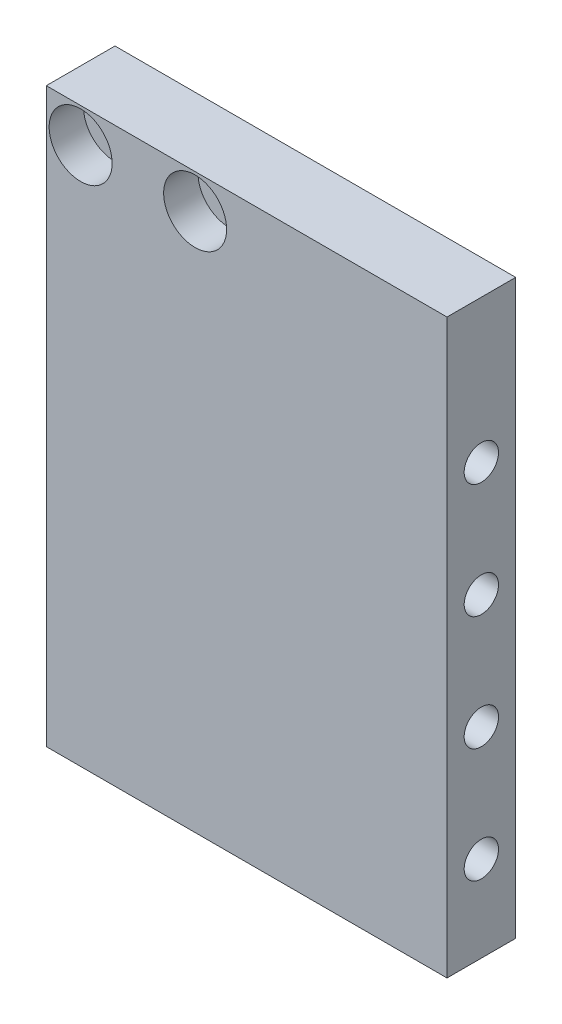
ISO-10303-21;
HEADER;
FILE_DESCRIPTION(('STEP AP214'),'2;1');
FILE_NAME('part.step','',(''),(''),'','','');
FILE_SCHEMA(('AUTOMOTIVE_DESIGN { 1 0 10303 214 1 1 1 1 }'));
ENDSEC;
DATA;
#1=APPLICATION_CONTEXT('core data for automotive mechanical design processes');
#2=APPLICATION_PROTOCOL_DEFINITION('international standard','automotive_design',2000,#1);
#3=PRODUCT_CONTEXT('',#1,'mechanical');
#4=PRODUCT('Part','Part','',(#3));
#5=PRODUCT_RELATED_PRODUCT_CATEGORY('part','',(#4));
#6=PRODUCT_DEFINITION_FORMATION('','',#4);
#7=PRODUCT_DEFINITION_CONTEXT('part definition',#1,'design');
#8=PRODUCT_DEFINITION('design','',#6,#7);
#9=PRODUCT_DEFINITION_SHAPE('','',#8);
#10=(LENGTH_UNIT() NAMED_UNIT(*) SI_UNIT(.MILLI.,.METRE.));
#11=(NAMED_UNIT(*) PLANE_ANGLE_UNIT() SI_UNIT($,.RADIAN.));
#12=(NAMED_UNIT(*) SI_UNIT($,.STERADIAN.) SOLID_ANGLE_UNIT());
#13=UNCERTAINTY_MEASURE_WITH_UNIT(LENGTH_MEASURE(1.E-05),#10,'distance_accuracy_value','');
#14=(GEOMETRIC_REPRESENTATION_CONTEXT(3) GLOBAL_UNCERTAINTY_ASSIGNED_CONTEXT((#13)) GLOBAL_UNIT_ASSIGNED_CONTEXT((#10,
#11,#12)) REPRESENTATION_CONTEXT('',''));
#15=CARTESIAN_POINT('',(0.,0.,0.));
#16=DIRECTION('',(0.,0.,1.));
#17=DIRECTION('',(1.,0.,0.));
#18=AXIS2_PLACEMENT_3D('',#15,#16,#17);
#19=CARTESIAN_POINT('',(-9.,44.,0.));
#20=DIRECTION('',(0.,0.,1.));
#21=DIRECTION('',(1.,0.,0.));
#22=AXIS2_PLACEMENT_3D('',#19,#20,#21);
#23=CYLINDRICAL_SURFACE('',#22,3.);
#24=CARTESIAN_POINT('',(-9.,44.,0.));
#25=DIRECTION('',(0.,0.,1.));
#26=DIRECTION('',(1.,0.,0.));
#27=AXIS2_PLACEMENT_3D('',#24,#25,#26);
#28=CIRCLE('',#27,3.);
#29=CARTESIAN_POINT('',(-6.,44.,0.));
#30=VERTEX_POINT('',#29);
#31=EDGE_CURVE('E114',#30,#30,#28,.T.);
#32=ORIENTED_EDGE('',*,*,#31,.F.);
#33=EDGE_LOOP('',(#32));
#34=FACE_BOUND('',#33,.T.);
#35=CARTESIAN_POINT('',(-9.,44.,6.));
#36=DIRECTION('',(0.,0.,1.));
#37=DIRECTION('',(1.,0.,0.));
#38=AXIS2_PLACEMENT_3D('',#35,#36,#37);
#39=CIRCLE('',#38,3.);
#40=CARTESIAN_POINT('',(-6.,44.,6.));
#41=VERTEX_POINT('',#40);
#42=EDGE_CURVE('E37',#41,#41,#39,.F.);
#43=ORIENTED_EDGE('',*,*,#42,.F.);
#44=EDGE_LOOP('',(#43));
#45=FACE_BOUND('',#44,.T.);
#46=ADVANCED_FACE('F33',(#34,#45),#23,.F.);
#47=CARTESIAN_POINT('',(-29.,44.,0.));
#48=DIRECTION('',(0.,0.,1.));
#49=DIRECTION('',(1.,0.,0.));
#50=AXIS2_PLACEMENT_3D('',#47,#48,#49);
#51=CYLINDRICAL_SURFACE('',#50,3.);
#52=CARTESIAN_POINT('',(-29.,44.,0.));
#53=DIRECTION('',(0.,0.,1.));
#54=DIRECTION('',(1.,0.,0.));
#55=AXIS2_PLACEMENT_3D('',#52,#53,#54);
#56=CIRCLE('',#55,3.);
#57=CARTESIAN_POINT('',(-26.,44.,0.));
#58=VERTEX_POINT('',#57);
#59=EDGE_CURVE('E133',#58,#58,#56,.T.);
#60=ORIENTED_EDGE('',*,*,#59,.F.);
#61=EDGE_LOOP('',(#60));
#62=FACE_BOUND('',#61,.T.);
#63=CARTESIAN_POINT('',(-29.,44.,6.));
#64=DIRECTION('',(0.,0.,1.));
#65=DIRECTION('',(1.,0.,0.));
#66=AXIS2_PLACEMENT_3D('',#63,#64,#65);
#67=CIRCLE('',#66,3.);
#68=CARTESIAN_POINT('',(-26.,44.,6.));
#69=VERTEX_POINT('',#68);
#70=EDGE_CURVE('E108',#69,#69,#67,.F.);
#71=ORIENTED_EDGE('',*,*,#70,.F.);
#72=EDGE_LOOP('',(#71));
#73=FACE_BOUND('',#72,.T.);
#74=ADVANCED_FACE('F166',(#62,#73),#51,.F.);
#75=CARTESIAN_POINT('',(-35.,-50.,12.));
#76=DIRECTION('',(1.,0.,0.));
#77=DIRECTION('',(0.,0.,-1.));
#78=AXIS2_PLACEMENT_3D('',#75,#76,#77);
#79=PLANE('',#78);
#80=CARTESIAN_POINT('',(-35.,-35.,6.));
#81=DIRECTION('',(-1.,0.,0.));
#82=DIRECTION('',(0.,0.,1.));
#83=AXIS2_PLACEMENT_3D('',#80,#81,#82);
#84=CIRCLE('',#83,3.);
#85=CARTESIAN_POINT('',(-35.,-35.,9.));
#86=VERTEX_POINT('',#85);
#87=EDGE_CURVE('E141',#86,#86,#84,.T.);
#88=ORIENTED_EDGE('',*,*,#87,.F.);
#89=EDGE_LOOP('',(#88));
#90=FACE_BOUND('',#89,.T.);
#91=CARTESIAN_POINT('',(-35.,-15.,6.));
#92=DIRECTION('',(-1.,0.,0.));
#93=DIRECTION('',(0.,0.,1.));
#94=AXIS2_PLACEMENT_3D('',#91,#92,#93);
#95=CIRCLE('',#94,3.);
#96=CARTESIAN_POINT('',(-35.,-15.,9.));
#97=VERTEX_POINT('',#96);
#98=EDGE_CURVE('E147',#97,#97,#95,.T.);
#99=ORIENTED_EDGE('',*,*,#98,.F.);
#100=EDGE_LOOP('',(#99));
#101=FACE_BOUND('',#100,.T.);
#102=CARTESIAN_POINT('',(-35.,5.,6.));
#103=DIRECTION('',(-1.,0.,0.));
#104=DIRECTION('',(0.,0.,1.));
#105=AXIS2_PLACEMENT_3D('',#102,#103,#104);
#106=CIRCLE('',#105,3.);
#107=CARTESIAN_POINT('',(-35.,5.,9.));
#108=VERTEX_POINT('',#107);
#109=EDGE_CURVE('E153',#108,#108,#106,.T.);
#110=ORIENTED_EDGE('',*,*,#109,.F.);
#111=EDGE_LOOP('',(#110));
#112=FACE_BOUND('',#111,.T.);
#113=CARTESIAN_POINT('',(-35.,25.,6.));
#114=DIRECTION('',(-1.,0.,0.));
#115=DIRECTION('',(0.,0.,1.));
#116=AXIS2_PLACEMENT_3D('',#113,#114,#115);
#117=CIRCLE('',#116,3.);
#118=CARTESIAN_POINT('',(-35.,25.,9.));
#119=VERTEX_POINT('',#118);
#120=EDGE_CURVE('E136',#119,#119,#117,.T.);
#121=ORIENTED_EDGE('',*,*,#120,.F.);
#122=EDGE_LOOP('',(#121));
#123=FACE_BOUND('',#122,.T.);
#124=DIRECTION('',(0.,-1.,0.));
#125=VECTOR('',#124,1.);
#126=CARTESIAN_POINT('',(-35.,-50.,0.));
#127=LINE('',#126,#125);
#128=CARTESIAN_POINT('',(-35.,50.,0.));
#129=VERTEX_POINT('',#128);
#130=CARTESIAN_POINT('',(-35.,-50.,0.));
#131=VERTEX_POINT('',#130);
#132=EDGE_CURVE('E100',#129,#131,#127,.T.);
#133=ORIENTED_EDGE('',*,*,#132,.T.);
#134=DIRECTION('',(0.,0.,-1.));
#135=VECTOR('',#134,1.);
#136=CARTESIAN_POINT('',(-35.,-50.,12.));
#137=LINE('',#136,#135);
#138=CARTESIAN_POINT('',(-35.,-50.,12.));
#139=VERTEX_POINT('',#138);
#140=EDGE_CURVE('E11',#139,#131,#137,.T.);
#141=ORIENTED_EDGE('',*,*,#140,.F.);
#142=DIRECTION('',(0.,-1.,0.));
#143=VECTOR('',#142,1.);
#144=CARTESIAN_POINT('',(-35.,-50.,12.));
#145=LINE('',#144,#143);
#146=CARTESIAN_POINT('',(-35.,50.,12.));
#147=VERTEX_POINT('',#146);
#148=EDGE_CURVE('E87',#147,#139,#145,.T.);
#149=ORIENTED_EDGE('',*,*,#148,.F.);
#150=DIRECTION('',(0.,0.,-1.));
#151=VECTOR('',#150,1.);
#152=CARTESIAN_POINT('',(-35.,50.,12.));
#153=LINE('',#152,#151);
#154=EDGE_CURVE('E96',#147,#129,#153,.T.);
#155=ORIENTED_EDGE('',*,*,#154,.T.);
#156=EDGE_LOOP('',(#133,#141,#149,#155));
#157=FACE_BOUND('',#156,.T.);
#158=ADVANCED_FACE('F35',(#90,#101,#112,#123,#157),#79,.F.);
#159=CARTESIAN_POINT('',(35.,-50.,12.));
#160=DIRECTION('',(0.,1.,0.));
#161=DIRECTION('',(-1.,0.,0.));
#162=AXIS2_PLACEMENT_3D('',#159,#160,#161);
#163=PLANE('',#162);
#164=CARTESIAN_POINT('',(-21.,-50.,6.));
#165=DIRECTION('',(0.,-1.,0.));
#166=DIRECTION('',(1.,0.,0.));
#167=AXIS2_PLACEMENT_3D('',#164,#165,#166);
#168=CIRCLE('',#167,3.);
#169=CARTESIAN_POINT('',(-18.,-50.,6.));
#170=VERTEX_POINT('',#169);
#171=EDGE_CURVE('E524',#170,#170,#168,.T.);
#172=ORIENTED_EDGE('',*,*,#171,.F.);
#173=EDGE_LOOP('',(#172));
#174=FACE_BOUND('',#173,.T.);
#175=CARTESIAN_POINT('',(-7.,-50.,6.));
#176=DIRECTION('',(0.,-1.,0.));
#177=DIRECTION('',(1.,0.,0.));
#178=AXIS2_PLACEMENT_3D('',#175,#176,#177);
#179=CIRCLE('',#178,3.);
#180=CARTESIAN_POINT('',(-4.,-50.,6.));
#181=VERTEX_POINT('',#180);
#182=EDGE_CURVE('E528',#181,#181,#179,.T.);
#183=ORIENTED_EDGE('',*,*,#182,.F.);
#184=EDGE_LOOP('',(#183));
#185=FACE_BOUND('',#184,.T.);
#186=CARTESIAN_POINT('',(7.,-50.,6.));
#187=DIRECTION('',(0.,-1.,0.));
#188=DIRECTION('',(1.,0.,0.));
#189=AXIS2_PLACEMENT_3D('',#186,#187,#188);
#190=CIRCLE('',#189,3.);
#191=CARTESIAN_POINT('',(10.,-50.,6.));
#192=VERTEX_POINT('',#191);
#193=EDGE_CURVE('E532',#192,#192,#190,.T.);
#194=ORIENTED_EDGE('',*,*,#193,.F.);
#195=EDGE_LOOP('',(#194));
#196=FACE_BOUND('',#195,.T.);
#197=CARTESIAN_POINT('',(21.,-50.,6.));
#198=DIRECTION('',(0.,-1.,0.));
#199=DIRECTION('',(1.,0.,0.));
#200=AXIS2_PLACEMENT_3D('',#197,#198,#199);
#201=CIRCLE('',#200,3.);
#202=CARTESIAN_POINT('',(24.,-50.,6.));
#203=VERTEX_POINT('',#202);
#204=EDGE_CURVE('E535',#203,#203,#201,.T.);
#205=ORIENTED_EDGE('',*,*,#204,.F.);
#206=EDGE_LOOP('',(#205));
#207=FACE_BOUND('',#206,.T.);
#208=DIRECTION('',(1.,0.,0.));
#209=VECTOR('',#208,1.);
#210=CARTESIAN_POINT('',(35.,-50.,0.));
#211=LINE('',#210,#209);
#212=CARTESIAN_POINT('',(35.,-50.,0.));
#213=VERTEX_POINT('',#212);
#214=EDGE_CURVE('E91',#131,#213,#211,.T.);
#215=ORIENTED_EDGE('',*,*,#214,.T.);
#216=DIRECTION('',(0.,0.,-1.));
#217=VECTOR('',#216,1.);
#218=CARTESIAN_POINT('',(35.,-50.,12.));
#219=LINE('',#218,#217);
#220=CARTESIAN_POINT('',(35.,-50.,12.));
#221=VERTEX_POINT('',#220);
#222=EDGE_CURVE('E43',#221,#213,#219,.T.);
#223=ORIENTED_EDGE('',*,*,#222,.F.);
#224=DIRECTION('',(1.,0.,0.));
#225=VECTOR('',#224,1.);
#226=CARTESIAN_POINT('',(35.,-50.,12.));
#227=LINE('',#226,#225);
#228=EDGE_CURVE('E82',#139,#221,#227,.T.);
#229=ORIENTED_EDGE('',*,*,#228,.F.);
#230=ORIENTED_EDGE('',*,*,#140,.T.);
#231=EDGE_LOOP('',(#215,#223,#229,#230));
#232=FACE_BOUND('',#231,.T.);
#233=ADVANCED_FACE('F90',(#174,#185,#196,#207,#232),#163,.F.);
#234=CARTESIAN_POINT('',(35.,-50.,12.));
#235=DIRECTION('',(-1.,0.,0.));
#236=DIRECTION('',(0.,0.,1.));
#237=AXIS2_PLACEMENT_3D('',#234,#235,#236);
#238=PLANE('',#237);
#239=CARTESIAN_POINT('',(35.,-35.,6.));
#240=DIRECTION('',(1.,0.,0.));
#241=DIRECTION('',(0.,0.,-1.));
#242=AXIS2_PLACEMENT_3D('',#239,#240,#241);
#243=CIRCLE('',#242,3.);
#244=CARTESIAN_POINT('',(35.,-35.,3.));
#245=VERTEX_POINT('',#244);
#246=EDGE_CURVE('E545',#245,#245,#243,.T.);
#247=ORIENTED_EDGE('',*,*,#246,.F.);
#248=EDGE_LOOP('',(#247));
#249=FACE_BOUND('',#248,.T.);
#250=CARTESIAN_POINT('',(35.,-15.,6.00000000000007));
#251=DIRECTION('',(1.,0.,0.));
#252=DIRECTION('',(0.,0.,-1.));
#253=AXIS2_PLACEMENT_3D('',#250,#251,#252);
#254=CIRCLE('',#253,3.);
#255=CARTESIAN_POINT('',(35.,-15.,3.00000000000007));
#256=VERTEX_POINT('',#255);
#257=EDGE_CURVE('E551',#256,#256,#254,.T.);
#258=ORIENTED_EDGE('',*,*,#257,.F.);
#259=EDGE_LOOP('',(#258));
#260=FACE_BOUND('',#259,.T.);
#261=CARTESIAN_POINT('',(35.,5.00000000000001,6.00000000000014));
#262=DIRECTION('',(1.,0.,0.));
#263=DIRECTION('',(0.,0.,-1.));
#264=AXIS2_PLACEMENT_3D('',#261,#262,#263);
#265=CIRCLE('',#264,3.);
#266=CARTESIAN_POINT('',(35.,5.00000000000001,3.00000000000014));
#267=VERTEX_POINT('',#266);
#268=EDGE_CURVE('E557',#267,#267,#265,.T.);
#269=ORIENTED_EDGE('',*,*,#268,.F.);
#270=EDGE_LOOP('',(#269));
#271=FACE_BOUND('',#270,.T.);
#272=CARTESIAN_POINT('',(35.,25.,6.00000000000021));
#273=DIRECTION('',(1.,0.,0.));
#274=DIRECTION('',(0.,0.,-1.));
#275=AXIS2_PLACEMENT_3D('',#272,#273,#274);
#276=CIRCLE('',#275,3.);
#277=CARTESIAN_POINT('',(35.,25.,3.0000000000002));
#278=VERTEX_POINT('',#277);
#279=EDGE_CURVE('E124',#278,#278,#276,.T.);
#280=ORIENTED_EDGE('',*,*,#279,.F.);
#281=EDGE_LOOP('',(#280));
#282=FACE_BOUND('',#281,.T.);
#283=DIRECTION('',(0.,1.,0.));
#284=VECTOR('',#283,1.);
#285=CARTESIAN_POINT('',(35.,-50.,0.));
#286=LINE('',#285,#284);
#287=CARTESIAN_POINT('',(35.,50.,0.));
#288=VERTEX_POINT('',#287);
#289=EDGE_CURVE('E69',#213,#288,#286,.T.);
#290=ORIENTED_EDGE('',*,*,#289,.T.);
#291=DIRECTION('',(0.,0.,-1.));
#292=VECTOR('',#291,1.);
#293=CARTESIAN_POINT('',(35.,50.,12.));
#294=LINE('',#293,#292);
#295=CARTESIAN_POINT('',(35.,50.,12.));
#296=VERTEX_POINT('',#295);
#297=EDGE_CURVE('E92',#296,#288,#294,.T.);
#298=ORIENTED_EDGE('',*,*,#297,.F.);
#299=DIRECTION('',(0.,1.,0.));
#300=VECTOR('',#299,1.);
#301=CARTESIAN_POINT('',(35.,-50.,12.));
#302=LINE('',#301,#300);
#303=EDGE_CURVE('E85',#221,#296,#302,.T.);
#304=ORIENTED_EDGE('',*,*,#303,.F.);
#305=ORIENTED_EDGE('',*,*,#222,.T.);
#306=EDGE_LOOP('',(#290,#298,#304,#305));
#307=FACE_BOUND('',#306,.T.);
#308=ADVANCED_FACE('F94',(#249,#260,#271,#282,#307),#238,.F.);
#309=CARTESIAN_POINT('',(35.,50.,12.));
#310=DIRECTION('',(0.,-1.,0.));
#311=DIRECTION('',(1.,0.,0.));
#312=AXIS2_PLACEMENT_3D('',#309,#310,#311);
#313=PLANE('',#312);
#314=DIRECTION('',(-1.,0.,0.));
#315=VECTOR('',#314,1.);
#316=CARTESIAN_POINT('',(35.,50.,0.));
#317=LINE('',#316,#315);
#318=EDGE_CURVE('E75',#288,#129,#317,.T.);
#319=ORIENTED_EDGE('',*,*,#318,.T.);
#320=ORIENTED_EDGE('',*,*,#154,.F.);
#321=DIRECTION('',(-1.,0.,0.));
#322=VECTOR('',#321,1.);
#323=CARTESIAN_POINT('',(35.,50.,12.));
#324=LINE('',#323,#322);
#325=EDGE_CURVE('E52',#296,#147,#324,.T.);
#326=ORIENTED_EDGE('',*,*,#325,.F.);
#327=ORIENTED_EDGE('',*,*,#297,.T.);
#328=EDGE_LOOP('',(#319,#320,#326,#327));
#329=FACE_BOUND('',#328,.T.);
#330=ADVANCED_FACE('F181',(#329),#313,.F.);
#331=CARTESIAN_POINT('',(0.,0.,12.));
#332=DIRECTION('',(0.,0.,1.));
#333=DIRECTION('',(1.,0.,0.));
#334=AXIS2_PLACEMENT_3D('',#331,#332,#333);
#335=PLANE('',#334);
#336=CARTESIAN_POINT('',(-29.,44.,12.));
#337=DIRECTION('',(0.,0.,1.));
#338=DIRECTION('',(1.,0.,0.));
#339=AXIS2_PLACEMENT_3D('',#336,#337,#338);
#340=CIRCLE('',#339,5.5);
#341=CARTESIAN_POINT('',(-23.5,44.,12.));
#342=VERTEX_POINT('',#341);
#343=EDGE_CURVE('E116',#342,#342,#340,.T.);
#344=ORIENTED_EDGE('',*,*,#343,.F.);
#345=EDGE_LOOP('',(#344));
#346=FACE_BOUND('',#345,.T.);
#347=CARTESIAN_POINT('',(-9.,44.,12.));
#348=DIRECTION('',(0.,0.,1.));
#349=DIRECTION('',(1.,0.,0.));
#350=AXIS2_PLACEMENT_3D('',#347,#348,#349);
#351=CIRCLE('',#350,5.5);
#352=CARTESIAN_POINT('',(-3.50000000000001,44.,12.));
#353=VERTEX_POINT('',#352);
#354=EDGE_CURVE('E129',#353,#353,#351,.T.);
#355=ORIENTED_EDGE('',*,*,#354,.F.);
#356=EDGE_LOOP('',(#355));
#357=FACE_BOUND('',#356,.T.);
#358=ORIENTED_EDGE('',*,*,#148,.T.);
#359=ORIENTED_EDGE('',*,*,#228,.T.);
#360=ORIENTED_EDGE('',*,*,#303,.T.);
#361=ORIENTED_EDGE('',*,*,#325,.T.);
#362=EDGE_LOOP('',(#358,#359,#360,#361));
#363=FACE_BOUND('',#362,.T.);
#364=ADVANCED_FACE('F83',(#346,#357,#363),#335,.T.);
#365=CARTESIAN_POINT('',(0.,0.,0.));
#366=DIRECTION('',(0.,0.,1.));
#367=DIRECTION('',(1.,0.,0.));
#368=AXIS2_PLACEMENT_3D('',#365,#366,#367);
#369=PLANE('',#368);
#370=ORIENTED_EDGE('',*,*,#59,.T.);
#371=EDGE_LOOP('',(#370));
#372=FACE_BOUND('',#371,.T.);
#373=ORIENTED_EDGE('',*,*,#31,.T.);
#374=EDGE_LOOP('',(#373));
#375=FACE_BOUND('',#374,.T.);
#376=ORIENTED_EDGE('',*,*,#132,.F.);
#377=ORIENTED_EDGE('',*,*,#318,.F.);
#378=ORIENTED_EDGE('',*,*,#289,.F.);
#379=ORIENTED_EDGE('',*,*,#214,.F.);
#380=EDGE_LOOP('',(#376,#377,#378,#379));
#381=FACE_BOUND('',#380,.T.);
#382=ADVANCED_FACE('F170',(#372,#375,#381),#369,.F.);
#383=CARTESIAN_POINT('',(-25.,25.,6.));
#384=DIRECTION('',(-1.,0.,0.));
#385=DIRECTION('',(0.,0.,1.));
#386=AXIS2_PLACEMENT_3D('',#383,#384,#385);
#387=CYLINDRICAL_SURFACE('',#386,3.);
#388=CARTESIAN_POINT('',(-25.,25.,6.));
#389=DIRECTION('',(-1.,0.,0.));
#390=DIRECTION('',(0.,0.,1.));
#391=AXIS2_PLACEMENT_3D('',#388,#389,#390);
#392=CIRCLE('',#391,3.);
#393=CARTESIAN_POINT('',(-25.,25.,9.));
#394=VERTEX_POINT('',#393);
#395=EDGE_CURVE('E156',#394,#394,#392,.T.);
#396=ORIENTED_EDGE('',*,*,#395,.F.);
#397=EDGE_LOOP('',(#396));
#398=FACE_BOUND('',#397,.T.);
#399=ORIENTED_EDGE('',*,*,#120,.T.);
#400=EDGE_LOOP('',(#399));
#401=FACE_BOUND('',#400,.T.);
#402=ADVANCED_FACE('F162',(#398,#401),#387,.F.);
#403=CARTESIAN_POINT('',(-25.,25.,6.));
#404=DIRECTION('',(-1.,0.,0.));
#405=DIRECTION('',(0.,0.,1.));
#406=AXIS2_PLACEMENT_3D('',#403,#404,#405);
#407=PLANE('',#406);
#408=ORIENTED_EDGE('',*,*,#395,.T.);
#409=EDGE_LOOP('',(#408));
#410=FACE_BOUND('',#409,.T.);
#411=ADVANCED_FACE('F178',(#410),#407,.T.);
#412=CARTESIAN_POINT('',(-25.,5.,6.));
#413=DIRECTION('',(-1.,0.,0.));
#414=DIRECTION('',(0.,0.,1.));
#415=AXIS2_PLACEMENT_3D('',#412,#413,#414);
#416=CYLINDRICAL_SURFACE('',#415,3.);
#417=CARTESIAN_POINT('',(-25.,5.,6.));
#418=DIRECTION('',(-1.,0.,0.));
#419=DIRECTION('',(0.,0.,1.));
#420=AXIS2_PLACEMENT_3D('',#417,#418,#419);
#421=CIRCLE('',#420,3.);
#422=CARTESIAN_POINT('',(-25.,5.,9.));
#423=VERTEX_POINT('',#422);
#424=EDGE_CURVE('E150',#423,#423,#421,.T.);
#425=ORIENTED_EDGE('',*,*,#424,.F.);
#426=EDGE_LOOP('',(#425));
#427=FACE_BOUND('',#426,.T.);
#428=ORIENTED_EDGE('',*,*,#109,.T.);
#429=EDGE_LOOP('',(#428));
#430=FACE_BOUND('',#429,.T.);
#431=ADVANCED_FACE('F218',(#427,#430),#416,.F.);
#432=CARTESIAN_POINT('',(-25.,5.,6.));
#433=DIRECTION('',(-1.,0.,0.));
#434=DIRECTION('',(0.,0.,1.));
#435=AXIS2_PLACEMENT_3D('',#432,#433,#434);
#436=PLANE('',#435);
#437=ORIENTED_EDGE('',*,*,#424,.T.);
#438=EDGE_LOOP('',(#437));
#439=FACE_BOUND('',#438,.T.);
#440=ADVANCED_FACE('F214',(#439),#436,.T.);
#441=CARTESIAN_POINT('',(-25.,-15.,6.));
#442=DIRECTION('',(-1.,0.,0.));
#443=DIRECTION('',(0.,0.,1.));
#444=AXIS2_PLACEMENT_3D('',#441,#442,#443);
#445=CYLINDRICAL_SURFACE('',#444,3.);
#446=CARTESIAN_POINT('',(-25.,-15.,6.));
#447=DIRECTION('',(-1.,0.,0.));
#448=DIRECTION('',(0.,0.,1.));
#449=AXIS2_PLACEMENT_3D('',#446,#447,#448);
#450=CIRCLE('',#449,3.);
#451=CARTESIAN_POINT('',(-25.,-15.,9.));
#452=VERTEX_POINT('',#451);
#453=EDGE_CURVE('E144',#452,#452,#450,.T.);
#454=ORIENTED_EDGE('',*,*,#453,.F.);
#455=EDGE_LOOP('',(#454));
#456=FACE_BOUND('',#455,.T.);
#457=ORIENTED_EDGE('',*,*,#98,.T.);
#458=EDGE_LOOP('',(#457));
#459=FACE_BOUND('',#458,.T.);
#460=ADVANCED_FACE('F210',(#456,#459),#445,.F.);
#461=CARTESIAN_POINT('',(-25.,-15.,6.));
#462=DIRECTION('',(-1.,0.,0.));
#463=DIRECTION('',(0.,0.,1.));
#464=AXIS2_PLACEMENT_3D('',#461,#462,#463);
#465=PLANE('',#464);
#466=ORIENTED_EDGE('',*,*,#453,.T.);
#467=EDGE_LOOP('',(#466));
#468=FACE_BOUND('',#467,.T.);
#469=ADVANCED_FACE('F206',(#468),#465,.T.);
#470=CARTESIAN_POINT('',(-25.,-35.,6.));
#471=DIRECTION('',(-1.,0.,0.));
#472=DIRECTION('',(0.,0.,1.));
#473=AXIS2_PLACEMENT_3D('',#470,#471,#472);
#474=CYLINDRICAL_SURFACE('',#473,3.);
#475=CARTESIAN_POINT('',(-25.,-35.,6.));
#476=DIRECTION('',(-1.,0.,0.));
#477=DIRECTION('',(0.,0.,1.));
#478=AXIS2_PLACEMENT_3D('',#475,#476,#477);
#479=CIRCLE('',#478,3.);
#480=CARTESIAN_POINT('',(-25.,-35.,9.));
#481=VERTEX_POINT('',#480);
#482=EDGE_CURVE('E103',#481,#481,#479,.T.);
#483=ORIENTED_EDGE('',*,*,#482,.F.);
#484=EDGE_LOOP('',(#483));
#485=FACE_BOUND('',#484,.T.);
#486=ORIENTED_EDGE('',*,*,#87,.T.);
#487=EDGE_LOOP('',(#486));
#488=FACE_BOUND('',#487,.T.);
#489=ADVANCED_FACE('F202',(#485,#488),#474,.F.);
#490=CARTESIAN_POINT('',(-25.,-35.,6.));
#491=DIRECTION('',(-1.,0.,0.));
#492=DIRECTION('',(0.,0.,1.));
#493=AXIS2_PLACEMENT_3D('',#490,#491,#492);
#494=PLANE('',#493);
#495=ORIENTED_EDGE('',*,*,#482,.T.);
#496=EDGE_LOOP('',(#495));
#497=FACE_BOUND('',#496,.T.);
#498=ADVANCED_FACE('F198',(#497),#494,.T.);
#499=CARTESIAN_POINT('',(-29.,44.,6.));
#500=DIRECTION('',(0.,0.,1.));
#501=DIRECTION('',(1.,0.,0.));
#502=AXIS2_PLACEMENT_3D('',#499,#500,#501);
#503=PLANE('',#502);
#504=CARTESIAN_POINT('',(-29.,44.,6.));
#505=DIRECTION('',(0.,0.,1.));
#506=DIRECTION('',(1.,0.,0.));
#507=AXIS2_PLACEMENT_3D('',#504,#505,#506);
#508=CIRCLE('',#507,5.5);
#509=CARTESIAN_POINT('',(-23.5,44.,6.));
#510=VERTEX_POINT('',#509);
#511=EDGE_CURVE('E110',#510,#510,#508,.T.);
#512=ORIENTED_EDGE('',*,*,#511,.T.);
#513=EDGE_LOOP('',(#512));
#514=FACE_BOUND('',#513,.T.);
#515=ORIENTED_EDGE('',*,*,#70,.T.);
#516=EDGE_LOOP('',(#515));
#517=FACE_BOUND('',#516,.T.);
#518=ADVANCED_FACE('F201',(#514,#517),#503,.T.);
#519=CARTESIAN_POINT('',(-29.,44.,6.));
#520=DIRECTION('',(0.,0.,1.));
#521=DIRECTION('',(1.,0.,0.));
#522=AXIS2_PLACEMENT_3D('',#519,#520,#521);
#523=CYLINDRICAL_SURFACE('',#522,5.5);
#524=ORIENTED_EDGE('',*,*,#511,.F.);
#525=EDGE_LOOP('',(#524));
#526=FACE_BOUND('',#525,.T.);
#527=ORIENTED_EDGE('',*,*,#343,.T.);
#528=EDGE_LOOP('',(#527));
#529=FACE_BOUND('',#528,.T.);
#530=ADVANCED_FACE('F260',(#526,#529),#523,.F.);
#531=CARTESIAN_POINT('',(-9.,44.,6.));
#532=DIRECTION('',(0.,0.,1.));
#533=DIRECTION('',(1.,0.,0.));
#534=AXIS2_PLACEMENT_3D('',#531,#532,#533);
#535=PLANE('',#534);
#536=CARTESIAN_POINT('',(-9.,44.,6.));
#537=DIRECTION('',(0.,0.,1.));
#538=DIRECTION('',(1.,0.,0.));
#539=AXIS2_PLACEMENT_3D('',#536,#537,#538);
#540=CIRCLE('',#539,5.5);
#541=CARTESIAN_POINT('',(-3.50000000000001,44.,6.));
#542=VERTEX_POINT('',#541);
#543=EDGE_CURVE('E121',#542,#542,#540,.T.);
#544=ORIENTED_EDGE('',*,*,#543,.T.);
#545=EDGE_LOOP('',(#544));
#546=FACE_BOUND('',#545,.T.);
#547=ORIENTED_EDGE('',*,*,#42,.T.);
#548=EDGE_LOOP('',(#547));
#549=FACE_BOUND('',#548,.T.);
#550=ADVANCED_FACE('F268',(#546,#549),#535,.T.);
#551=CARTESIAN_POINT('',(-9.,44.,6.));
#552=DIRECTION('',(0.,0.,1.));
#553=DIRECTION('',(1.,0.,0.));
#554=AXIS2_PLACEMENT_3D('',#551,#552,#553);
#555=CYLINDRICAL_SURFACE('',#554,5.5);
#556=ORIENTED_EDGE('',*,*,#543,.F.);
#557=EDGE_LOOP('',(#556));
#558=FACE_BOUND('',#557,.T.);
#559=ORIENTED_EDGE('',*,*,#354,.T.);
#560=EDGE_LOOP('',(#559));
#561=FACE_BOUND('',#560,.T.);
#562=ADVANCED_FACE('F276',(#558,#561),#555,.F.);
#563=CARTESIAN_POINT('',(25.,25.,6.00000000000021));
#564=DIRECTION('',(1.,0.,0.));
#565=DIRECTION('',(0.,0.,-1.));
#566=AXIS2_PLACEMENT_3D('',#563,#564,#565);
#567=CYLINDRICAL_SURFACE('',#566,3.);
#568=CARTESIAN_POINT('',(25.,25.,6.00000000000021));
#569=DIRECTION('',(1.,0.,0.));
#570=DIRECTION('',(0.,0.,-1.));
#571=AXIS2_PLACEMENT_3D('',#568,#569,#570);
#572=CIRCLE('',#571,3.);
#573=CARTESIAN_POINT('',(25.,25.,3.0000000000002));
#574=VERTEX_POINT('',#573);
#575=EDGE_CURVE('E559',#574,#574,#572,.T.);
#576=ORIENTED_EDGE('',*,*,#575,.F.);
#577=EDGE_LOOP('',(#576));
#578=FACE_BOUND('',#577,.T.);
#579=ORIENTED_EDGE('',*,*,#279,.T.);
#580=EDGE_LOOP('',(#579));
#581=FACE_BOUND('',#580,.T.);
#582=ADVANCED_FACE('F284',(#578,#581),#567,.F.);
#583=CARTESIAN_POINT('',(25.,25.,6.00000000000021));
#584=DIRECTION('',(1.,0.,0.));
#585=DIRECTION('',(0.,0.,-1.));
#586=AXIS2_PLACEMENT_3D('',#583,#584,#585);
#587=PLANE('',#586);
#588=ORIENTED_EDGE('',*,*,#575,.T.);
#589=EDGE_LOOP('',(#588));
#590=FACE_BOUND('',#589,.T.);
#591=ADVANCED_FACE('F292',(#590),#587,.T.);
#592=CARTESIAN_POINT('',(25.,5.00000000000001,6.00000000000014));
#593=DIRECTION('',(1.,0.,0.));
#594=DIRECTION('',(0.,0.,-1.));
#595=AXIS2_PLACEMENT_3D('',#592,#593,#594);
#596=CYLINDRICAL_SURFACE('',#595,3.);
#597=CARTESIAN_POINT('',(25.,5.00000000000001,6.00000000000014));
#598=DIRECTION('',(1.,0.,0.));
#599=DIRECTION('',(0.,0.,-1.));
#600=AXIS2_PLACEMENT_3D('',#597,#598,#599);
#601=CIRCLE('',#600,3.);
#602=CARTESIAN_POINT('',(25.,5.00000000000001,3.00000000000014));
#603=VERTEX_POINT('',#602);
#604=EDGE_CURVE('E554',#603,#603,#601,.T.);
#605=ORIENTED_EDGE('',*,*,#604,.F.);
#606=EDGE_LOOP('',(#605));
#607=FACE_BOUND('',#606,.T.);
#608=ORIENTED_EDGE('',*,*,#268,.T.);
#609=EDGE_LOOP('',(#608));
#610=FACE_BOUND('',#609,.T.);
#611=ADVANCED_FACE('F300',(#607,#610),#596,.F.);
#612=CARTESIAN_POINT('',(25.,5.00000000000001,6.00000000000014));
#613=DIRECTION('',(1.,0.,0.));
#614=DIRECTION('',(0.,0.,-1.));
#615=AXIS2_PLACEMENT_3D('',#612,#613,#614);
#616=PLANE('',#615);
#617=ORIENTED_EDGE('',*,*,#604,.T.);
#618=EDGE_LOOP('',(#617));
#619=FACE_BOUND('',#618,.T.);
#620=ADVANCED_FACE('F308',(#619),#616,.T.);
#621=CARTESIAN_POINT('',(25.,-15.,6.00000000000007));
#622=DIRECTION('',(1.,0.,0.));
#623=DIRECTION('',(0.,0.,-1.));
#624=AXIS2_PLACEMENT_3D('',#621,#622,#623);
#625=CYLINDRICAL_SURFACE('',#624,3.);
#626=CARTESIAN_POINT('',(25.,-15.,6.00000000000007));
#627=DIRECTION('',(1.,0.,0.));
#628=DIRECTION('',(0.,0.,-1.));
#629=AXIS2_PLACEMENT_3D('',#626,#627,#628);
#630=CIRCLE('',#629,3.);
#631=CARTESIAN_POINT('',(25.,-15.,3.00000000000007));
#632=VERTEX_POINT('',#631);
#633=EDGE_CURVE('E548',#632,#632,#630,.T.);
#634=ORIENTED_EDGE('',*,*,#633,.F.);
#635=EDGE_LOOP('',(#634));
#636=FACE_BOUND('',#635,.T.);
#637=ORIENTED_EDGE('',*,*,#257,.T.);
#638=EDGE_LOOP('',(#637));
#639=FACE_BOUND('',#638,.T.);
#640=ADVANCED_FACE('F316',(#636,#639),#625,.F.);
#641=CARTESIAN_POINT('',(25.,-15.,6.00000000000007));
#642=DIRECTION('',(1.,0.,0.));
#643=DIRECTION('',(0.,0.,-1.));
#644=AXIS2_PLACEMENT_3D('',#641,#642,#643);
#645=PLANE('',#644);
#646=ORIENTED_EDGE('',*,*,#633,.T.);
#647=EDGE_LOOP('',(#646));
#648=FACE_BOUND('',#647,.T.);
#649=ADVANCED_FACE('F324',(#648),#645,.T.);
#650=CARTESIAN_POINT('',(25.,-35.,6.));
#651=DIRECTION('',(1.,0.,0.));
#652=DIRECTION('',(0.,0.,-1.));
#653=AXIS2_PLACEMENT_3D('',#650,#651,#652);
#654=CYLINDRICAL_SURFACE('',#653,3.);
#655=CARTESIAN_POINT('',(25.,-35.,6.));
#656=DIRECTION('',(1.,0.,0.));
#657=DIRECTION('',(0.,0.,-1.));
#658=AXIS2_PLACEMENT_3D('',#655,#656,#657);
#659=CIRCLE('',#658,3.);
#660=CARTESIAN_POINT('',(25.,-35.,3.));
#661=VERTEX_POINT('',#660);
#662=EDGE_CURVE('E132',#661,#661,#659,.T.);
#663=ORIENTED_EDGE('',*,*,#662,.F.);
#664=EDGE_LOOP('',(#663));
#665=FACE_BOUND('',#664,.T.);
#666=ORIENTED_EDGE('',*,*,#246,.T.);
#667=EDGE_LOOP('',(#666));
#668=FACE_BOUND('',#667,.T.);
#669=ADVANCED_FACE('F332',(#665,#668),#654,.F.);
#670=CARTESIAN_POINT('',(25.,-35.,6.));
#671=DIRECTION('',(1.,0.,0.));
#672=DIRECTION('',(0.,0.,-1.));
#673=AXIS2_PLACEMENT_3D('',#670,#671,#672);
#674=PLANE('',#673);
#675=ORIENTED_EDGE('',*,*,#662,.T.);
#676=EDGE_LOOP('',(#675));
#677=FACE_BOUND('',#676,.T.);
#678=ADVANCED_FACE('F340',(#677),#674,.T.);
#679=CARTESIAN_POINT('',(21.,-40.,6.));
#680=DIRECTION('',(0.,-1.,0.));
#681=DIRECTION('',(1.,0.,0.));
#682=AXIS2_PLACEMENT_3D('',#679,#680,#681);
#683=CYLINDRICAL_SURFACE('',#682,3.);
#684=CARTESIAN_POINT('',(21.,-40.,6.));
#685=DIRECTION('',(0.,-1.,0.));
#686=DIRECTION('',(1.,0.,0.));
#687=AXIS2_PLACEMENT_3D('',#684,#685,#686);
#688=CIRCLE('',#687,3.);
#689=CARTESIAN_POINT('',(24.,-40.,6.));
#690=VERTEX_POINT('',#689);
#691=EDGE_CURVE('E537',#690,#690,#688,.T.);
#692=ORIENTED_EDGE('',*,*,#691,.F.);
#693=EDGE_LOOP('',(#692));
#694=FACE_BOUND('',#693,.T.);
#695=ORIENTED_EDGE('',*,*,#204,.T.);
#696=EDGE_LOOP('',(#695));
#697=FACE_BOUND('',#696,.T.);
#698=ADVANCED_FACE('F348',(#694,#697),#683,.F.);
#699=CARTESIAN_POINT('',(21.,-40.,6.));
#700=DIRECTION('',(0.,-1.,0.));
#701=DIRECTION('',(1.,0.,0.));
#702=AXIS2_PLACEMENT_3D('',#699,#700,#701);
#703=PLANE('',#702);
#704=ORIENTED_EDGE('',*,*,#691,.T.);
#705=EDGE_LOOP('',(#704));
#706=FACE_BOUND('',#705,.T.);
#707=ADVANCED_FACE('F357',(#706),#703,.T.);
#708=CARTESIAN_POINT('',(7.,-40.,6.));
#709=DIRECTION('',(0.,-1.,0.));
#710=DIRECTION('',(1.,0.,0.));
#711=AXIS2_PLACEMENT_3D('',#708,#709,#710);
#712=CYLINDRICAL_SURFACE('',#711,3.);
#713=CARTESIAN_POINT('',(7.,-40.,6.));
#714=DIRECTION('',(0.,-1.,0.));
#715=DIRECTION('',(1.,0.,0.));
#716=AXIS2_PLACEMENT_3D('',#713,#714,#715);
#717=CIRCLE('',#716,3.);
#718=CARTESIAN_POINT('',(10.,-40.,6.));
#719=VERTEX_POINT('',#718);
#720=EDGE_CURVE('E575',#719,#719,#717,.T.);
#721=ORIENTED_EDGE('',*,*,#720,.F.);
#722=EDGE_LOOP('',(#721));
#723=FACE_BOUND('',#722,.T.);
#724=ORIENTED_EDGE('',*,*,#193,.T.);
#725=EDGE_LOOP('',(#724));
#726=FACE_BOUND('',#725,.T.);
#727=ADVANCED_FACE('F365',(#723,#726),#712,.F.);
#728=CARTESIAN_POINT('',(7.,-40.,6.));
#729=DIRECTION('',(0.,-1.,0.));
#730=DIRECTION('',(1.,0.,0.));
#731=AXIS2_PLACEMENT_3D('',#728,#729,#730);
#732=PLANE('',#731);
#733=ORIENTED_EDGE('',*,*,#720,.T.);
#734=EDGE_LOOP('',(#733));
#735=FACE_BOUND('',#734,.T.);
#736=ADVANCED_FACE('F373',(#735),#732,.T.);
#737=CARTESIAN_POINT('',(-7.,-40.,6.));
#738=DIRECTION('',(0.,-1.,0.));
#739=DIRECTION('',(1.,0.,0.));
#740=AXIS2_PLACEMENT_3D('',#737,#738,#739);
#741=CYLINDRICAL_SURFACE('',#740,3.);
#742=CARTESIAN_POINT('',(-7.,-40.,6.));
#743=DIRECTION('',(0.,-1.,0.));
#744=DIRECTION('',(1.,0.,0.));
#745=AXIS2_PLACEMENT_3D('',#742,#743,#744);
#746=CIRCLE('',#745,3.);
#747=CARTESIAN_POINT('',(-4.,-40.,6.));
#748=VERTEX_POINT('',#747);
#749=EDGE_CURVE('E569',#748,#748,#746,.T.);
#750=ORIENTED_EDGE('',*,*,#749,.F.);
#751=EDGE_LOOP('',(#750));
#752=FACE_BOUND('',#751,.T.);
#753=ORIENTED_EDGE('',*,*,#182,.T.);
#754=EDGE_LOOP('',(#753));
#755=FACE_BOUND('',#754,.T.);
#756=ADVANCED_FACE('F381',(#752,#755),#741,.F.);
#757=CARTESIAN_POINT('',(-7.,-40.,6.));
#758=DIRECTION('',(0.,-1.,0.));
#759=DIRECTION('',(1.,0.,0.));
#760=AXIS2_PLACEMENT_3D('',#757,#758,#759);
#761=PLANE('',#760);
#762=ORIENTED_EDGE('',*,*,#749,.T.);
#763=EDGE_LOOP('',(#762));
#764=FACE_BOUND('',#763,.T.);
#765=ADVANCED_FACE('F389',(#764),#761,.T.);
#766=CARTESIAN_POINT('',(-21.,-40.,6.));
#767=DIRECTION('',(0.,-1.,0.));
#768=DIRECTION('',(1.,0.,0.));
#769=AXIS2_PLACEMENT_3D('',#766,#767,#768);
#770=CYLINDRICAL_SURFACE('',#769,3.);
#771=CARTESIAN_POINT('',(-21.,-40.,6.));
#772=DIRECTION('',(0.,-1.,0.));
#773=DIRECTION('',(1.,0.,0.));
#774=AXIS2_PLACEMENT_3D('',#771,#772,#773);
#775=CIRCLE('',#774,3.);
#776=CARTESIAN_POINT('',(-18.,-40.,6.));
#777=VERTEX_POINT('',#776);
#778=EDGE_CURVE('E563',#777,#777,#775,.T.);
#779=ORIENTED_EDGE('',*,*,#778,.F.);
#780=EDGE_LOOP('',(#779));
#781=FACE_BOUND('',#780,.T.);
#782=ORIENTED_EDGE('',*,*,#171,.T.);
#783=EDGE_LOOP('',(#782));
#784=FACE_BOUND('',#783,.T.);
#785=ADVANCED_FACE('F397',(#781,#784),#770,.F.);
#786=CARTESIAN_POINT('',(-21.,-40.,6.));
#787=DIRECTION('',(0.,-1.,0.));
#788=DIRECTION('',(1.,0.,0.));
#789=AXIS2_PLACEMENT_3D('',#786,#787,#788);
#790=PLANE('',#789);
#791=ORIENTED_EDGE('',*,*,#778,.T.);
#792=EDGE_LOOP('',(#791));
#793=FACE_BOUND('',#792,.T.);
#794=ADVANCED_FACE('F405',(#793),#790,.T.);
#795=CLOSED_SHELL('',(#46,#74,#158,#233,#308,#330,#364,#382,#402,#411,#431,#440,#460,#469,#489,
#498,#518,#530,#550,#562,#582,#591,#611,#620,#640,#649,#669,#678,#698,#707,#727,#736,#756,#765,
#785,#794));
#796=MANIFOLD_SOLID_BREP('B2',#795);
#797=ADVANCED_BREP_SHAPE_REPRESENTATION('',(#18,#796),#14);
#798=SHAPE_DEFINITION_REPRESENTATION(#9,#797);
ENDSEC;
END-ISO-10303-21;
